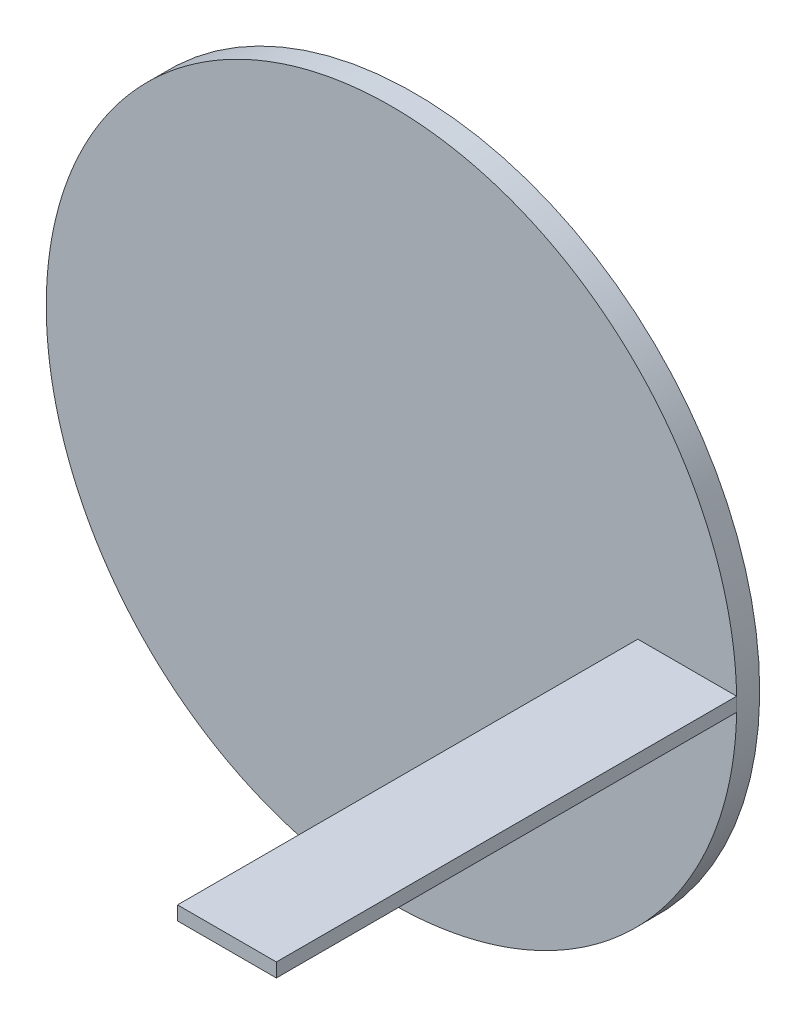
ISO-10303-21;
HEADER;
FILE_DESCRIPTION(('STEP AP214'),'2;1');
FILE_NAME('part.step','',(''),(''),'','','');
FILE_SCHEMA(('AUTOMOTIVE_DESIGN { 1 0 10303 214 1 1 1 1 }'));
ENDSEC;
DATA;
#1=APPLICATION_CONTEXT('core data for automotive mechanical design processes');
#2=APPLICATION_PROTOCOL_DEFINITION('international standard','automotive_design',2000,#1);
#3=PRODUCT_CONTEXT('',#1,'mechanical');
#4=PRODUCT('Part','Part','',(#3));
#5=PRODUCT_RELATED_PRODUCT_CATEGORY('part','',(#4));
#6=PRODUCT_DEFINITION_FORMATION('','',#4);
#7=PRODUCT_DEFINITION_CONTEXT('part definition',#1,'design');
#8=PRODUCT_DEFINITION('design','',#6,#7);
#9=PRODUCT_DEFINITION_SHAPE('','',#8);
#10=(LENGTH_UNIT() NAMED_UNIT(*) SI_UNIT(.MILLI.,.METRE.));
#11=(NAMED_UNIT(*) PLANE_ANGLE_UNIT() SI_UNIT($,.RADIAN.));
#12=(NAMED_UNIT(*) SI_UNIT($,.STERADIAN.) SOLID_ANGLE_UNIT());
#13=UNCERTAINTY_MEASURE_WITH_UNIT(LENGTH_MEASURE(1.E-05),#10,'distance_accuracy_value','');
#14=(GEOMETRIC_REPRESENTATION_CONTEXT(3) GLOBAL_UNCERTAINTY_ASSIGNED_CONTEXT((#13)) GLOBAL_UNIT_ASSIGNED_CONTEXT((#10,
#11,#12)) REPRESENTATION_CONTEXT('',''));
#15=CARTESIAN_POINT('',(0.,0.,0.));
#16=DIRECTION('',(0.,0.,1.));
#17=DIRECTION('',(1.,0.,0.));
#18=AXIS2_PLACEMENT_3D('',#15,#16,#17);
#19=CARTESIAN_POINT('',(0.,0.,5.));
#20=DIRECTION('',(0.,0.,-1.));
#21=DIRECTION('',(-1.,0.,0.));
#22=AXIS2_PLACEMENT_3D('',#19,#20,#21);
#23=CYLINDRICAL_SURFACE('',#22,75.);
#24=CARTESIAN_POINT('',(0.,0.,5.));
#25=DIRECTION('',(0.,0.,1.));
#26=DIRECTION('',(1.,0.,0.));
#27=AXIS2_PLACEMENT_3D('',#24,#25,#26);
#28=CIRCLE('',#27,75.);
#29=CARTESIAN_POINT('',(74.984632759074,-1.51817324004955,5.));
#30=VERTEX_POINT('',#29);
#31=EDGE_CURVE('E11',#30,#30,#28,.T.);
#32=ORIENTED_EDGE('',*,*,#31,.F.);
#33=EDGE_LOOP('',(#32));
#34=FACE_BOUND('',#33,.T.);
#35=CARTESIAN_POINT('',(0.,0.,0.));
#36=DIRECTION('',(0.,0.,1.));
#37=DIRECTION('',(1.,0.,0.));
#38=AXIS2_PLACEMENT_3D('',#35,#36,#37);
#39=CIRCLE('',#38,75.);
#40=CARTESIAN_POINT('',(75.,0.,0.));
#41=VERTEX_POINT('',#40);
#42=EDGE_CURVE('E54',#41,#41,#39,.T.);
#43=ORIENTED_EDGE('',*,*,#42,.T.);
#44=EDGE_LOOP('',(#43));
#45=FACE_BOUND('',#44,.T.);
#46=ADVANCED_FACE('F45',(#34,#45),#23,.T.);
#47=CARTESIAN_POINT('',(0.,0.,5.));
#48=DIRECTION('',(0.,0.,1.));
#49=DIRECTION('',(1.,0.,0.));
#50=AXIS2_PLACEMENT_3D('',#47,#48,#49);
#51=PLANE('',#50);
#52=DIRECTION('',(0.,1.,0.));
#53=VECTOR('',#52,1.);
#54=CARTESIAN_POINT('',(74.9846327590741,-1.51817324004955,5.));
#55=LINE('',#54,#53);
#56=CARTESIAN_POINT('',(74.9846327590741,1.50504399009494,5.));
#57=VERTEX_POINT('',#56);
#58=EDGE_CURVE('E110',#30,#57,#55,.T.);
#59=ORIENTED_EDGE('',*,*,#58,.F.);
#60=ORIENTED_EDGE('',*,*,#31,.T.);
#61=DIRECTION('',(1.,0.,0.));
#62=VECTOR('',#61,1.);
#63=CARTESIAN_POINT('',(74.9846327590741,-1.51817324004955,5.));
#64=LINE('',#63,#62);
#65=CARTESIAN_POINT('',(53.5161582480555,-1.51817324004956,5.));
#66=VERTEX_POINT('',#65);
#67=EDGE_CURVE('E61',#66,#30,#64,.T.);
#68=ORIENTED_EDGE('',*,*,#67,.F.);
#69=DIRECTION('',(0.,-1.,0.));
#70=VECTOR('',#69,1.);
#71=CARTESIAN_POINT('',(53.5161582480555,-1.51817324004956,5.));
#72=LINE('',#71,#70);
#73=CARTESIAN_POINT('',(53.5161582480555,1.50504399009494,5.));
#74=VERTEX_POINT('',#73);
#75=EDGE_CURVE('E157',#74,#66,#72,.T.);
#76=ORIENTED_EDGE('',*,*,#75,.F.);
#77=DIRECTION('',(-1.,0.,0.));
#78=VECTOR('',#77,1.);
#79=CARTESIAN_POINT('',(74.9846327590741,1.50504399009494,5.));
#80=LINE('',#79,#78);
#81=EDGE_CURVE('E67',#57,#74,#80,.T.);
#82=ORIENTED_EDGE('',*,*,#81,.F.);
#83=EDGE_LOOP('',(#59,#60,#68,#76,#82));
#84=FACE_BOUND('',#83,.T.);
#85=ADVANCED_FACE('F143',(#84),#51,.T.);
#86=CARTESIAN_POINT('',(0.,0.,0.));
#87=DIRECTION('',(0.,0.,1.));
#88=DIRECTION('',(1.,0.,0.));
#89=AXIS2_PLACEMENT_3D('',#86,#87,#88);
#90=PLANE('',#89);
#91=CARTESIAN_POINT('',(0.,0.,0.));
#92=DIRECTION('',(0.,0.,1.));
#93=DIRECTION('',(1.,0.,0.));
#94=AXIS2_PLACEMENT_3D('',#91,#92,#93);
#95=CIRCLE('',#94,10.);
#96=CARTESIAN_POINT('',(10.,0.,0.));
#97=VERTEX_POINT('',#96);
#98=EDGE_CURVE('E48',#97,#97,#95,.T.);
#99=ORIENTED_EDGE('',*,*,#98,.T.);
#100=EDGE_LOOP('',(#99));
#101=FACE_BOUND('',#100,.T.);
#102=ORIENTED_EDGE('',*,*,#42,.F.);
#103=EDGE_LOOP('',(#102));
#104=FACE_BOUND('',#103,.T.);
#105=ADVANCED_FACE('F129',(#101,#104),#90,.F.);
#106=CARTESIAN_POINT('',(0.,0.,-25.));
#107=DIRECTION('',(0.,0.,1.));
#108=DIRECTION('',(1.,0.,0.));
#109=AXIS2_PLACEMENT_3D('',#106,#107,#108);
#110=CYLINDRICAL_SURFACE('',#109,10.);
#111=CARTESIAN_POINT('',(0.,0.,-25.));
#112=DIRECTION('',(0.,0.,1.));
#113=DIRECTION('',(1.,0.,0.));
#114=AXIS2_PLACEMENT_3D('',#111,#112,#113);
#115=CIRCLE('',#114,10.);
#116=CARTESIAN_POINT('',(10.,0.,-25.));
#117=VERTEX_POINT('',#116);
#118=EDGE_CURVE('E112',#117,#117,#115,.T.);
#119=ORIENTED_EDGE('',*,*,#118,.T.);
#120=EDGE_LOOP('',(#119));
#121=FACE_BOUND('',#120,.T.);
#122=ORIENTED_EDGE('',*,*,#98,.F.);
#123=EDGE_LOOP('',(#122));
#124=FACE_BOUND('',#123,.T.);
#125=ADVANCED_FACE('F132',(#121,#124),#110,.T.);
#126=CARTESIAN_POINT('',(0.,0.,-25.));
#127=DIRECTION('',(0.,0.,1.));
#128=DIRECTION('',(1.,0.,0.));
#129=AXIS2_PLACEMENT_3D('',#126,#127,#128);
#130=PLANE('',#129);
#131=ORIENTED_EDGE('',*,*,#118,.F.);
#132=EDGE_LOOP('',(#131));
#133=FACE_BOUND('',#132,.T.);
#134=ADVANCED_FACE('F134',(#133),#130,.F.);
#135=CARTESIAN_POINT('',(74.9846327590741,-1.51817324004955,105.));
#136=DIRECTION('',(-1.,0.,0.));
#137=DIRECTION('',(0.,0.,1.));
#138=AXIS2_PLACEMENT_3D('',#135,#136,#137);
#139=PLANE('',#138);
#140=ORIENTED_EDGE('',*,*,#58,.T.);
#141=DIRECTION('',(0.,0.,-1.));
#142=VECTOR('',#141,1.);
#143=CARTESIAN_POINT('',(74.9846327590741,1.50504399009494,105.));
#144=LINE('',#143,#142);
#145=CARTESIAN_POINT('',(74.9846327590741,1.50504399009494,105.));
#146=VERTEX_POINT('',#145);
#147=EDGE_CURVE('E90',#146,#57,#144,.T.);
#148=ORIENTED_EDGE('',*,*,#147,.F.);
#149=DIRECTION('',(0.,1.,0.));
#150=VECTOR('',#149,1.);
#151=CARTESIAN_POINT('',(74.9846327590741,-1.51817324004955,105.));
#152=LINE('',#151,#150);
#153=CARTESIAN_POINT('',(74.9846327590741,-1.51817324004955,105.));
#154=VERTEX_POINT('',#153);
#155=EDGE_CURVE('E98',#154,#146,#152,.T.);
#156=ORIENTED_EDGE('',*,*,#155,.F.);
#157=DIRECTION('',(0.,0.,-1.));
#158=VECTOR('',#157,1.);
#159=CARTESIAN_POINT('',(74.9846327590741,-1.51817324004955,105.));
#160=LINE('',#159,#158);
#161=EDGE_CURVE('E154',#154,#30,#160,.T.);
#162=ORIENTED_EDGE('',*,*,#161,.T.);
#163=EDGE_LOOP('',(#140,#148,#156,#162));
#164=FACE_BOUND('',#163,.T.);
#165=ADVANCED_FACE('F109',(#164),#139,.F.);
#166=CARTESIAN_POINT('',(74.9846327590741,1.50504399009494,105.));
#167=DIRECTION('',(0.,-1.,0.));
#168=DIRECTION('',(0.,0.,-1.));
#169=AXIS2_PLACEMENT_3D('',#166,#167,#168);
#170=PLANE('',#169);
#171=ORIENTED_EDGE('',*,*,#81,.T.);
#172=DIRECTION('',(0.,0.,-1.));
#173=VECTOR('',#172,1.);
#174=CARTESIAN_POINT('',(53.5161582480555,1.50504399009494,105.));
#175=LINE('',#174,#173);
#176=CARTESIAN_POINT('',(53.5161582480555,1.50504399009494,105.));
#177=VERTEX_POINT('',#176);
#178=EDGE_CURVE('E93',#177,#74,#175,.T.);
#179=ORIENTED_EDGE('',*,*,#178,.F.);
#180=DIRECTION('',(-1.,0.,0.));
#181=VECTOR('',#180,1.);
#182=CARTESIAN_POINT('',(74.9846327590741,1.50504399009494,105.));
#183=LINE('',#182,#181);
#184=EDGE_CURVE('E86',#146,#177,#183,.T.);
#185=ORIENTED_EDGE('',*,*,#184,.F.);
#186=ORIENTED_EDGE('',*,*,#147,.T.);
#187=EDGE_LOOP('',(#171,#179,#185,#186));
#188=FACE_BOUND('',#187,.T.);
#189=ADVANCED_FACE('F88',(#188),#170,.F.);
#190=CARTESIAN_POINT('',(53.5161582480555,-1.51817324004956,105.));
#191=DIRECTION('',(1.,0.,0.));
#192=DIRECTION('',(0.,0.,-1.));
#193=AXIS2_PLACEMENT_3D('',#190,#191,#192);
#194=PLANE('',#193);
#195=ORIENTED_EDGE('',*,*,#75,.T.);
#196=DIRECTION('',(0.,0.,-1.));
#197=VECTOR('',#196,1.);
#198=CARTESIAN_POINT('',(53.5161582480555,-1.51817324004956,105.));
#199=LINE('',#198,#197);
#200=CARTESIAN_POINT('',(53.5161582480555,-1.51817324004956,105.));
#201=VERTEX_POINT('',#200);
#202=EDGE_CURVE('E118',#201,#66,#199,.T.);
#203=ORIENTED_EDGE('',*,*,#202,.F.);
#204=DIRECTION('',(0.,-1.,0.));
#205=VECTOR('',#204,1.);
#206=CARTESIAN_POINT('',(53.5161582480555,-1.51817324004956,105.));
#207=LINE('',#206,#205);
#208=EDGE_CURVE('E97',#177,#201,#207,.T.);
#209=ORIENTED_EDGE('',*,*,#208,.F.);
#210=ORIENTED_EDGE('',*,*,#178,.T.);
#211=EDGE_LOOP('',(#195,#203,#209,#210));
#212=FACE_BOUND('',#211,.T.);
#213=ADVANCED_FACE('F173',(#212),#194,.F.);
#214=CARTESIAN_POINT('',(74.9846327590741,-1.51817324004955,105.));
#215=DIRECTION('',(0.,1.,0.));
#216=DIRECTION('',(-1.,0.,0.));
#217=AXIS2_PLACEMENT_3D('',#214,#215,#216);
#218=PLANE('',#217);
#219=ORIENTED_EDGE('',*,*,#67,.T.);
#220=ORIENTED_EDGE('',*,*,#161,.F.);
#221=DIRECTION('',(1.,0.,0.));
#222=VECTOR('',#221,1.);
#223=CARTESIAN_POINT('',(74.9846327590741,-1.51817324004955,105.));
#224=LINE('',#223,#222);
#225=EDGE_CURVE('E103',#201,#154,#224,.T.);
#226=ORIENTED_EDGE('',*,*,#225,.F.);
#227=ORIENTED_EDGE('',*,*,#202,.T.);
#228=EDGE_LOOP('',(#219,#220,#226,#227));
#229=FACE_BOUND('',#228,.T.);
#230=ADVANCED_FACE('F153',(#229),#218,.F.);
#231=CARTESIAN_POINT('',(0.,0.,105.));
#232=DIRECTION('',(0.,0.,1.));
#233=DIRECTION('',(1.,0.,0.));
#234=AXIS2_PLACEMENT_3D('',#231,#232,#233);
#235=PLANE('',#234);
#236=ORIENTED_EDGE('',*,*,#155,.T.);
#237=ORIENTED_EDGE('',*,*,#184,.T.);
#238=ORIENTED_EDGE('',*,*,#208,.T.);
#239=ORIENTED_EDGE('',*,*,#225,.T.);
#240=EDGE_LOOP('',(#236,#237,#238,#239));
#241=FACE_BOUND('',#240,.T.);
#242=ADVANCED_FACE('F101',(#241),#235,.T.);
#243=CLOSED_SHELL('',(#46,#85,#105,#125,#134,#165,#189,#213,#230,#242));
#244=MANIFOLD_SOLID_BREP('B2',#243);
#245=ADVANCED_BREP_SHAPE_REPRESENTATION('',(#18,#244),#14);
#246=SHAPE_DEFINITION_REPRESENTATION(#9,#245);
ENDSEC;
END-ISO-10303-21;
